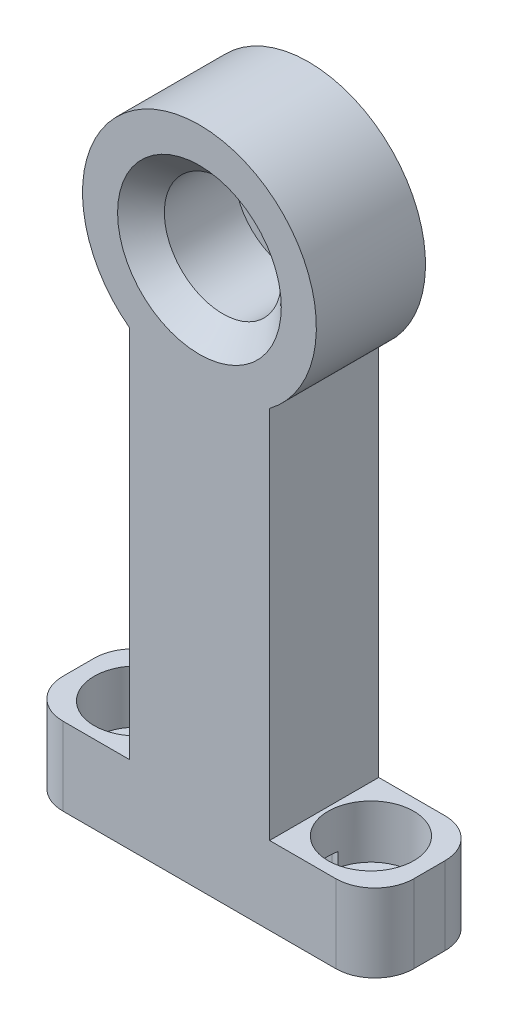
ISO-10303-21;
HEADER;
FILE_DESCRIPTION(('STEP AP214'),'2;1');
FILE_NAME('part.step','',(''),(''),'','','');
FILE_SCHEMA(('AUTOMOTIVE_DESIGN { 1 0 10303 214 1 1 1 1 }'));
ENDSEC;
DATA;
#1=APPLICATION_CONTEXT('core data for automotive mechanical design processes');
#2=APPLICATION_PROTOCOL_DEFINITION('international standard','automotive_design',2000,#1);
#3=PRODUCT_CONTEXT('',#1,'mechanical');
#4=PRODUCT('Part','Part','',(#3));
#5=PRODUCT_RELATED_PRODUCT_CATEGORY('part','',(#4));
#6=PRODUCT_DEFINITION_FORMATION('','',#4);
#7=PRODUCT_DEFINITION_CONTEXT('part definition',#1,'design');
#8=PRODUCT_DEFINITION('design','',#6,#7);
#9=PRODUCT_DEFINITION_SHAPE('','',#8);
#10=(LENGTH_UNIT() NAMED_UNIT(*) SI_UNIT(.MILLI.,.METRE.));
#11=(NAMED_UNIT(*) PLANE_ANGLE_UNIT() SI_UNIT($,.RADIAN.));
#12=(NAMED_UNIT(*) SI_UNIT($,.STERADIAN.) SOLID_ANGLE_UNIT());
#13=UNCERTAINTY_MEASURE_WITH_UNIT(LENGTH_MEASURE(1.E-05),#10,'distance_accuracy_value','');
#14=(GEOMETRIC_REPRESENTATION_CONTEXT(3) GLOBAL_UNCERTAINTY_ASSIGNED_CONTEXT((#13)) GLOBAL_UNIT_ASSIGNED_CONTEXT((#10,
#11,#12)) REPRESENTATION_CONTEXT('',''));
#15=CARTESIAN_POINT('',(0.,0.,0.));
#16=DIRECTION('',(0.,0.,1.));
#17=DIRECTION('',(1.,0.,0.));
#18=AXIS2_PLACEMENT_3D('',#15,#16,#17);
#19=CARTESIAN_POINT('',(0.,0.,7.));
#20=DIRECTION('',(0.,0.,-1.));
#21=DIRECTION('',(-1.,0.,0.));
#22=AXIS2_PLACEMENT_3D('',#19,#20,#21);
#23=CYLINDRICAL_SURFACE('',#22,0.5);
#24=CARTESIAN_POINT('',(0.,0.,-7.));
#25=DIRECTION('',(0.,0.,1.));
#26=DIRECTION('',(1.,0.,0.));
#27=AXIS2_PLACEMENT_3D('',#24,#25,#26);
#28=CIRCLE('',#27,0.5);
#29=CARTESIAN_POINT('',(0.5,0.,-7.));
#30=VERTEX_POINT('',#29);
#31=EDGE_CURVE('E227',#30,#30,#28,.T.);
#32=ORIENTED_EDGE('',*,*,#31,.F.);
#33=EDGE_LOOP('',(#32));
#34=FACE_BOUND('',#33,.T.);
#35=CARTESIAN_POINT('',(0.,0.,-5.));
#36=DIRECTION('',(0.,0.,1.));
#37=DIRECTION('',(1.,0.,0.));
#38=AXIS2_PLACEMENT_3D('',#35,#36,#37);
#39=CIRCLE('',#38,0.5);
#40=CARTESIAN_POINT('',(0.5,0.,-5.));
#41=VERTEX_POINT('',#40);
#42=EDGE_CURVE('E235',#41,#41,#39,.T.);
#43=ORIENTED_EDGE('',*,*,#42,.T.);
#44=EDGE_LOOP('',(#43));
#45=FACE_BOUND('',#44,.T.);
#46=ADVANCED_FACE('F38',(#34,#45),#23,.F.);
#47=CARTESIAN_POINT('',(0.,0.,7.));
#48=DIRECTION('',(0.,0.,1.));
#49=DIRECTION('',(1.,0.,0.));
#50=AXIS2_PLACEMENT_3D('',#47,#48,#49);
#51=PLANE('',#50);
#52=CARTESIAN_POINT('',(0.,0.,7.));
#53=DIRECTION('',(0.,0.,1.));
#54=DIRECTION('',(1.,0.,0.));
#55=AXIS2_PLACEMENT_3D('',#52,#53,#54);
#56=CIRCLE('',#55,10.5);
#57=CARTESIAN_POINT('',(10.5,0.,7.));
#58=VERTEX_POINT('',#57);
#59=EDGE_CURVE('E218',#58,#58,#56,.F.);
#60=ORIENTED_EDGE('',*,*,#59,.T.);
#61=EDGE_LOOP('',(#60));
#62=FACE_BOUND('',#61,.T.);
#63=DIRECTION('',(1.,0.,0.));
#64=VECTOR('',#63,1.);
#65=CARTESIAN_POINT('',(0.,-70.,7.));
#66=LINE('',#65,#64);
#67=CARTESIAN_POINT('',(-17.4999999999999,-70.,7.));
#68=VERTEX_POINT('',#67);
#69=CARTESIAN_POINT('',(17.5,-70.,7.));
#70=VERTEX_POINT('',#69);
#71=EDGE_CURVE('E280',#68,#70,#66,.T.);
#72=ORIENTED_EDGE('',*,*,#71,.T.);
#73=DIRECTION('',(0.,-1.,0.));
#74=VECTOR('',#73,1.);
#75=CARTESIAN_POINT('',(17.5,0.,7.));
#76=LINE('',#75,#74);
#77=CARTESIAN_POINT('',(17.5,-60.,7.));
#78=VERTEX_POINT('',#77);
#79=EDGE_CURVE('E191',#70,#78,#76,.F.);
#80=ORIENTED_EDGE('',*,*,#79,.T.);
#81=DIRECTION('',(-1.,0.,0.));
#82=VECTOR('',#81,1.);
#83=CARTESIAN_POINT('',(0.,-60.,7.));
#84=LINE('',#83,#82);
#85=CARTESIAN_POINT('',(9.,-60.,7.));
#86=VERTEX_POINT('',#85);
#87=EDGE_CURVE('E278',#78,#86,#84,.T.);
#88=ORIENTED_EDGE('',*,*,#87,.T.);
#89=DIRECTION('',(0.,1.,0.));
#90=VECTOR('',#89,1.);
#91=CARTESIAN_POINT('',(9.,0.,7.));
#92=LINE('',#91,#90);
#93=CARTESIAN_POINT('',(9.,-12.,7.));
#94=VERTEX_POINT('',#93);
#95=EDGE_CURVE('E260',#86,#94,#92,.T.);
#96=ORIENTED_EDGE('',*,*,#95,.T.);
#97=CARTESIAN_POINT('',(0.,0.,7.));
#98=DIRECTION('',(0.,0.,1.));
#99=DIRECTION('',(1.,0.,0.));
#100=AXIS2_PLACEMENT_3D('',#97,#98,#99);
#101=CIRCLE('',#100,15.);
#102=CARTESIAN_POINT('',(-9.,-12.,7.));
#103=VERTEX_POINT('',#102);
#104=EDGE_CURVE('E224',#94,#103,#101,.T.);
#105=ORIENTED_EDGE('',*,*,#104,.T.);
#106=DIRECTION('',(0.,1.,0.));
#107=VECTOR('',#106,1.);
#108=CARTESIAN_POINT('',(-9.,0.,7.));
#109=LINE('',#108,#107);
#110=CARTESIAN_POINT('',(-9.,-60.,7.));
#111=VERTEX_POINT('',#110);
#112=EDGE_CURVE('E264',#111,#103,#109,.T.);
#113=ORIENTED_EDGE('',*,*,#112,.F.);
#114=DIRECTION('',(-1.,0.,0.));
#115=VECTOR('',#114,1.);
#116=CARTESIAN_POINT('',(0.,-60.,7.));
#117=LINE('',#116,#115);
#118=CARTESIAN_POINT('',(-17.4999999999999,-60.,7.));
#119=VERTEX_POINT('',#118);
#120=EDGE_CURVE('E283',#111,#119,#117,.T.);
#121=ORIENTED_EDGE('',*,*,#120,.T.);
#122=DIRECTION('',(0.,-1.,0.));
#123=VECTOR('',#122,1.);
#124=CARTESIAN_POINT('',(-17.4999999999999,-70.,7.));
#125=LINE('',#124,#123);
#126=EDGE_CURVE('E193',#119,#68,#125,.T.);
#127=ORIENTED_EDGE('',*,*,#126,.T.);
#128=EDGE_LOOP('',(#72,#80,#88,#96,#105,#113,#121,#127));
#129=FACE_BOUND('',#128,.T.);
#130=ADVANCED_FACE('F372',(#62,#129),#51,.T.);
#131=CARTESIAN_POINT('',(0.,0.,-7.));
#132=DIRECTION('',(0.,0.,1.));
#133=DIRECTION('',(1.,0.,0.));
#134=AXIS2_PLACEMENT_3D('',#131,#132,#133);
#135=PLANE('',#134);
#136=DIRECTION('',(-1.,0.,0.));
#137=VECTOR('',#136,1.);
#138=CARTESIAN_POINT('',(0.,-60.,-7.));
#139=LINE('',#138,#137);
#140=CARTESIAN_POINT('',(17.5,-60.,-7.));
#141=VERTEX_POINT('',#140);
#142=CARTESIAN_POINT('',(9.,-60.,-7.));
#143=VERTEX_POINT('',#142);
#144=EDGE_CURVE('E265',#141,#143,#139,.T.);
#145=ORIENTED_EDGE('',*,*,#144,.F.);
#146=DIRECTION('',(0.,-1.,0.));
#147=VECTOR('',#146,1.);
#148=CARTESIAN_POINT('',(17.5,-70.,-7.));
#149=LINE('',#148,#147);
#150=CARTESIAN_POINT('',(17.5,-70.,-7.));
#151=VERTEX_POINT('',#150);
#152=EDGE_CURVE('E213',#141,#151,#149,.T.);
#153=ORIENTED_EDGE('',*,*,#152,.T.);
#154=DIRECTION('',(1.,0.,0.));
#155=VECTOR('',#154,1.);
#156=CARTESIAN_POINT('',(0.,-70.,-7.));
#157=LINE('',#156,#155);
#158=CARTESIAN_POINT('',(-17.4999999999999,-70.,-7.));
#159=VERTEX_POINT('',#158);
#160=EDGE_CURVE('E267',#159,#151,#157,.T.);
#161=ORIENTED_EDGE('',*,*,#160,.F.);
#162=DIRECTION('',(0.,-1.,0.));
#163=VECTOR('',#162,1.);
#164=CARTESIAN_POINT('',(-17.4999999999999,0.,-7.));
#165=LINE('',#164,#163);
#166=CARTESIAN_POINT('',(-17.4999999999999,-60.,-7.));
#167=VERTEX_POINT('',#166);
#168=EDGE_CURVE('E216',#159,#167,#165,.F.);
#169=ORIENTED_EDGE('',*,*,#168,.T.);
#170=DIRECTION('',(-1.,0.,0.));
#171=VECTOR('',#170,1.);
#172=CARTESIAN_POINT('',(0.,-60.,-7.));
#173=LINE('',#172,#171);
#174=CARTESIAN_POINT('',(-9.,-60.,-7.));
#175=VERTEX_POINT('',#174);
#176=EDGE_CURVE('E270',#175,#167,#173,.T.);
#177=ORIENTED_EDGE('',*,*,#176,.F.);
#178=DIRECTION('',(0.,1.,0.));
#179=VECTOR('',#178,1.);
#180=CARTESIAN_POINT('',(-9.,0.,-7.));
#181=LINE('',#180,#179);
#182=CARTESIAN_POINT('',(-9.,-12.,-7.));
#183=VERTEX_POINT('',#182);
#184=EDGE_CURVE('E272',#175,#183,#181,.T.);
#185=ORIENTED_EDGE('',*,*,#184,.T.);
#186=CARTESIAN_POINT('',(0.,0.,-7.));
#187=DIRECTION('',(0.,0.,1.));
#188=DIRECTION('',(1.,0.,0.));
#189=AXIS2_PLACEMENT_3D('',#186,#187,#188);
#190=CIRCLE('',#189,15.);
#191=CARTESIAN_POINT('',(9.,-12.,-7.));
#192=VERTEX_POINT('',#191);
#193=EDGE_CURVE('E225',#192,#183,#190,.T.);
#194=ORIENTED_EDGE('',*,*,#193,.F.);
#195=DIRECTION('',(0.,1.,0.));
#196=VECTOR('',#195,1.);
#197=CARTESIAN_POINT('',(9.,0.,-7.));
#198=LINE('',#197,#196);
#199=EDGE_CURVE('E261',#143,#192,#198,.T.);
#200=ORIENTED_EDGE('',*,*,#199,.F.);
#201=EDGE_LOOP('',(#145,#153,#161,#169,#177,#185,#194,#200));
#202=FACE_BOUND('',#201,.T.);
#203=ORIENTED_EDGE('',*,*,#31,.T.);
#204=EDGE_LOOP('',(#203));
#205=FACE_BOUND('',#204,.T.);
#206=ADVANCED_FACE('F377',(#202,#205),#135,.F.);
#207=CARTESIAN_POINT('',(0.,0.,7.));
#208=DIRECTION('',(0.,0.,-1.));
#209=DIRECTION('',(-1.,0.,0.));
#210=AXIS2_PLACEMENT_3D('',#207,#208,#209);
#211=CYLINDRICAL_SURFACE('',#210,15.);
#212=ORIENTED_EDGE('',*,*,#193,.T.);
#213=DIRECTION('',(0.,0.,-1.));
#214=VECTOR('',#213,1.);
#215=CARTESIAN_POINT('',(-9.,-12.,7.));
#216=LINE('',#215,#214);
#217=EDGE_CURVE('E238',#103,#183,#216,.T.);
#218=ORIENTED_EDGE('',*,*,#217,.F.);
#219=ORIENTED_EDGE('',*,*,#104,.F.);
#220=DIRECTION('',(0.,0.,-1.));
#221=VECTOR('',#220,1.);
#222=CARTESIAN_POINT('',(9.,-12.,7.));
#223=LINE('',#222,#221);
#224=EDGE_CURVE('E257',#94,#192,#223,.T.);
#225=ORIENTED_EDGE('',*,*,#224,.T.);
#226=EDGE_LOOP('',(#212,#218,#219,#225));
#227=FACE_BOUND('',#226,.T.);
#228=ADVANCED_FACE('F382',(#227),#211,.T.);
#229=CARTESIAN_POINT('',(0.,0.,-5.));
#230=DIRECTION('',(0.,0.,1.));
#231=DIRECTION('',(1.,0.,0.));
#232=AXIS2_PLACEMENT_3D('',#229,#230,#231);
#233=CYLINDRICAL_SURFACE('',#232,7.5);
#234=CARTESIAN_POINT('',(0.,0.,4.));
#235=DIRECTION('',(0.,0.,1.));
#236=DIRECTION('',(1.,0.,0.));
#237=AXIS2_PLACEMENT_3D('',#234,#235,#236);
#238=CIRCLE('',#237,7.5);
#239=CARTESIAN_POINT('',(7.5,0.,4.));
#240=VERTEX_POINT('',#239);
#241=EDGE_CURVE('E221',#240,#240,#238,.T.);
#242=ORIENTED_EDGE('',*,*,#241,.T.);
#243=EDGE_LOOP('',(#242));
#244=FACE_BOUND('',#243,.T.);
#245=CARTESIAN_POINT('',(0.,0.,-5.));
#246=DIRECTION('',(0.,0.,1.));
#247=DIRECTION('',(1.,0.,0.));
#248=AXIS2_PLACEMENT_3D('',#245,#246,#247);
#249=CIRCLE('',#248,7.5);
#250=CARTESIAN_POINT('',(7.5,0.,-5.));
#251=VERTEX_POINT('',#250);
#252=EDGE_CURVE('E232',#251,#251,#249,.T.);
#253=ORIENTED_EDGE('',*,*,#252,.F.);
#254=EDGE_LOOP('',(#253));
#255=FACE_BOUND('',#254,.T.);
#256=ADVANCED_FACE('F422',(#244,#255),#233,.F.);
#257=CARTESIAN_POINT('',(0.,0.,-5.));
#258=DIRECTION('',(0.,0.,1.));
#259=DIRECTION('',(1.,0.,0.));
#260=AXIS2_PLACEMENT_3D('',#257,#258,#259);
#261=PLANE('',#260);
#262=ORIENTED_EDGE('',*,*,#42,.F.);
#263=EDGE_LOOP('',(#262));
#264=FACE_BOUND('',#263,.T.);
#265=ORIENTED_EDGE('',*,*,#252,.T.);
#266=EDGE_LOOP('',(#265));
#267=FACE_BOUND('',#266,.T.);
#268=ADVANCED_FACE('F434',(#264,#267),#261,.T.);
#269=CARTESIAN_POINT('',(0.,0.,4.));
#270=DIRECTION('',(0.,0.,1.));
#271=DIRECTION('',(1.,0.,0.));
#272=AXIS2_PLACEMENT_3D('',#269,#270,#271);
#273=CONICAL_SURFACE('',#272,7.5,0.78539816339745);
#274=ORIENTED_EDGE('',*,*,#59,.F.);
#275=EDGE_LOOP('',(#274));
#276=FACE_BOUND('',#275,.T.);
#277=ORIENTED_EDGE('',*,*,#241,.F.);
#278=EDGE_LOOP('',(#277));
#279=FACE_BOUND('',#278,.T.);
#280=ADVANCED_FACE('F430',(#276,#279),#273,.F.);
#281=CARTESIAN_POINT('',(-9.,0.,7.));
#282=DIRECTION('',(-1.,0.,0.));
#283=DIRECTION('',(0.,0.,1.));
#284=AXIS2_PLACEMENT_3D('',#281,#282,#283);
#285=PLANE('',#284);
#286=ORIENTED_EDGE('',*,*,#184,.F.);
#287=DIRECTION('',(0.,0.,-1.));
#288=VECTOR('',#287,1.);
#289=CARTESIAN_POINT('',(-9.,-60.,7.));
#290=LINE('',#289,#288);
#291=EDGE_CURVE('E241',#111,#175,#290,.T.);
#292=ORIENTED_EDGE('',*,*,#291,.F.);
#293=ORIENTED_EDGE('',*,*,#112,.T.);
#294=ORIENTED_EDGE('',*,*,#217,.T.);
#295=EDGE_LOOP('',(#286,#292,#293,#294));
#296=FACE_BOUND('',#295,.T.);
#297=ADVANCED_FACE('F351',(#296),#285,.T.);
#298=CARTESIAN_POINT('',(0.,-60.,7.));
#299=DIRECTION('',(0.,-1.,0.));
#300=DIRECTION('',(0.,0.,-1.));
#301=AXIS2_PLACEMENT_3D('',#298,#299,#300);
#302=PLANE('',#301);
#303=CARTESIAN_POINT('',(-15.,-60.,0.));
#304=DIRECTION('',(0.,1.,0.));
#305=DIRECTION('',(0.,0.,1.));
#306=AXIS2_PLACEMENT_3D('',#303,#304,#305);
#307=CIRCLE('',#306,5.5);
#308=CARTESIAN_POINT('',(-15.,-60.,5.5));
#309=VERTEX_POINT('',#308);
#310=EDGE_CURVE('E342',#309,#309,#307,.T.);
#311=ORIENTED_EDGE('',*,*,#310,.F.);
#312=EDGE_LOOP('',(#311));
#313=FACE_BOUND('',#312,.T.);
#314=ORIENTED_EDGE('',*,*,#176,.T.);
#315=CARTESIAN_POINT('',(-17.4999999999999,-60.,-2.));
#316=DIRECTION('',(0.,-1.,0.));
#317=DIRECTION('',(0.,0.,-1.));
#318=AXIS2_PLACEMENT_3D('',#315,#316,#317);
#319=CIRCLE('',#318,5.);
#320=CARTESIAN_POINT('',(-22.4999999999999,-60.,-2.));
#321=VERTEX_POINT('',#320);
#322=EDGE_CURVE('E61',#167,#321,#319,.F.);
#323=ORIENTED_EDGE('',*,*,#322,.T.);
#324=DIRECTION('',(0.,0.,-1.));
#325=VECTOR('',#324,1.);
#326=CARTESIAN_POINT('',(-22.4999999999999,-60.,7.));
#327=LINE('',#326,#325);
#328=CARTESIAN_POINT('',(-22.4999999999999,-60.,2.));
#329=VERTEX_POINT('',#328);
#330=EDGE_CURVE('E243',#329,#321,#327,.T.);
#331=ORIENTED_EDGE('',*,*,#330,.F.);
#332=CARTESIAN_POINT('',(-17.4999999999999,-60.,2.));
#333=DIRECTION('',(0.,-1.,0.));
#334=DIRECTION('',(0.,0.,-1.));
#335=AXIS2_PLACEMENT_3D('',#332,#333,#334);
#336=CIRCLE('',#335,5.);
#337=EDGE_CURVE('E184',#329,#119,#336,.F.);
#338=ORIENTED_EDGE('',*,*,#337,.T.);
#339=ORIENTED_EDGE('',*,*,#120,.F.);
#340=ORIENTED_EDGE('',*,*,#291,.T.);
#341=EDGE_LOOP('',(#314,#323,#331,#338,#339,#340));
#342=FACE_BOUND('',#341,.T.);
#343=ADVANCED_FACE('F348',(#313,#342),#302,.F.);
#344=CARTESIAN_POINT('',(-22.4999999999999,0.,7.));
#345=DIRECTION('',(1.,0.,0.));
#346=DIRECTION('',(0.,0.,-1.));
#347=AXIS2_PLACEMENT_3D('',#344,#345,#346);
#348=PLANE('',#347);
#349=ORIENTED_EDGE('',*,*,#330,.T.);
#350=DIRECTION('',(0.,-1.,0.));
#351=VECTOR('',#350,1.);
#352=CARTESIAN_POINT('',(-22.4999999999999,0.,-2.));
#353=LINE('',#352,#351);
#354=CARTESIAN_POINT('',(-22.4999999999999,-70.,-2.));
#355=VERTEX_POINT('',#354);
#356=EDGE_CURVE('E186',#321,#355,#353,.T.);
#357=ORIENTED_EDGE('',*,*,#356,.T.);
#358=DIRECTION('',(0.,0.,-1.));
#359=VECTOR('',#358,1.);
#360=CARTESIAN_POINT('',(-22.4999999999999,-70.,7.));
#361=LINE('',#360,#359);
#362=CARTESIAN_POINT('',(-22.4999999999999,-70.,2.));
#363=VERTEX_POINT('',#362);
#364=EDGE_CURVE('E245',#363,#355,#361,.T.);
#365=ORIENTED_EDGE('',*,*,#364,.F.);
#366=DIRECTION('',(0.,-1.,0.));
#367=VECTOR('',#366,1.);
#368=CARTESIAN_POINT('',(-22.4999999999999,-60.,2.));
#369=LINE('',#368,#367);
#370=EDGE_CURVE('E189',#363,#329,#369,.F.);
#371=ORIENTED_EDGE('',*,*,#370,.T.);
#372=EDGE_LOOP('',(#349,#357,#365,#371));
#373=FACE_BOUND('',#372,.T.);
#374=ADVANCED_FACE('F350',(#373),#348,.F.);
#375=CARTESIAN_POINT('',(0.,-70.,7.));
#376=DIRECTION('',(0.,1.,0.));
#377=DIRECTION('',(0.,0.,1.));
#378=AXIS2_PLACEMENT_3D('',#375,#376,#377);
#379=PLANE('',#378);
#380=CARTESIAN_POINT('',(-15.,-70.,0.));
#381=DIRECTION('',(0.,1.,0.));
#382=DIRECTION('',(0.,0.,1.));
#383=AXIS2_PLACEMENT_3D('',#380,#381,#382);
#384=CIRCLE('',#383,3.2);
#385=CARTESIAN_POINT('',(-15.,-70.,3.2));
#386=VERTEX_POINT('',#385);
#387=EDGE_CURVE('E333',#386,#386,#384,.T.);
#388=ORIENTED_EDGE('',*,*,#387,.T.);
#389=EDGE_LOOP('',(#388));
#390=FACE_BOUND('',#389,.T.);
#391=CARTESIAN_POINT('',(15.,-70.,0.));
#392=DIRECTION('',(0.,1.,0.));
#393=DIRECTION('',(0.,0.,1.));
#394=AXIS2_PLACEMENT_3D('',#391,#392,#393);
#395=CIRCLE('',#394,3.2);
#396=CARTESIAN_POINT('',(15.,-70.,3.19999999999999));
#397=VERTEX_POINT('',#396);
#398=EDGE_CURVE('E326',#397,#397,#395,.T.);
#399=ORIENTED_EDGE('',*,*,#398,.T.);
#400=EDGE_LOOP('',(#399));
#401=FACE_BOUND('',#400,.T.);
#402=CARTESIAN_POINT('',(-7.,-70.,0.));
#403=DIRECTION('',(0.,-1.,0.));
#404=DIRECTION('',(0.,0.,-1.));
#405=AXIS2_PLACEMENT_3D('',#402,#403,#404);
#406=CIRCLE('',#405,2.);
#407=CARTESIAN_POINT('',(-7.,-70.,-2.));
#408=VERTEX_POINT('',#407);
#409=EDGE_CURVE('E322',#408,#408,#406,.T.);
#410=ORIENTED_EDGE('',*,*,#409,.F.);
#411=EDGE_LOOP('',(#410));
#412=FACE_BOUND('',#411,.T.);
#413=DIRECTION('',(1.,0.,0.));
#414=VECTOR('',#413,1.);
#415=CARTESIAN_POINT('',(6.,-70.,-2.));
#416=LINE('',#415,#414);
#417=CARTESIAN_POINT('',(6.,-70.,-2.));
#418=VERTEX_POINT('',#417);
#419=CARTESIAN_POINT('',(8.,-70.,-2.));
#420=VERTEX_POINT('',#419);
#421=EDGE_CURVE('E304',#418,#420,#416,.T.);
#422=ORIENTED_EDGE('',*,*,#421,.F.);
#423=CARTESIAN_POINT('',(6.,-70.,0.));
#424=DIRECTION('',(0.,-1.,0.));
#425=DIRECTION('',(0.,0.,-1.));
#426=AXIS2_PLACEMENT_3D('',#423,#424,#425);
#427=CIRCLE('',#426,2.);
#428=CARTESIAN_POINT('',(6.,-70.,2.));
#429=VERTEX_POINT('',#428);
#430=EDGE_CURVE('E307',#429,#418,#427,.T.);
#431=ORIENTED_EDGE('',*,*,#430,.F.);
#432=DIRECTION('',(-1.,0.,0.));
#433=VECTOR('',#432,1.);
#434=CARTESIAN_POINT('',(6.,-70.,2.));
#435=LINE('',#434,#433);
#436=CARTESIAN_POINT('',(8.,-70.,2.));
#437=VERTEX_POINT('',#436);
#438=EDGE_CURVE('E297',#437,#429,#435,.T.);
#439=ORIENTED_EDGE('',*,*,#438,.F.);
#440=CARTESIAN_POINT('',(8.,-70.,0.));
#441=DIRECTION('',(0.,-1.,0.));
#442=DIRECTION('',(0.,0.,-1.));
#443=AXIS2_PLACEMENT_3D('',#440,#441,#442);
#444=CIRCLE('',#443,2.);
#445=EDGE_CURVE('E301',#420,#437,#444,.T.);
#446=ORIENTED_EDGE('',*,*,#445,.F.);
#447=EDGE_LOOP('',(#422,#431,#439,#446));
#448=FACE_BOUND('',#447,.T.);
#449=ORIENTED_EDGE('',*,*,#160,.T.);
#450=CARTESIAN_POINT('',(17.5,-70.,-2.));
#451=DIRECTION('',(0.,1.,0.));
#452=DIRECTION('',(0.,0.,1.));
#453=AXIS2_PLACEMENT_3D('',#450,#451,#452);
#454=CIRCLE('',#453,5.);
#455=CARTESIAN_POINT('',(22.5,-70.,-2.));
#456=VERTEX_POINT('',#455);
#457=EDGE_CURVE('E205',#151,#456,#454,.F.);
#458=ORIENTED_EDGE('',*,*,#457,.T.);
#459=DIRECTION('',(0.,0.,-1.));
#460=VECTOR('',#459,1.);
#461=CARTESIAN_POINT('',(22.5,-70.,7.));
#462=LINE('',#461,#460);
#463=CARTESIAN_POINT('',(22.5,-70.,2.));
#464=VERTEX_POINT('',#463);
#465=EDGE_CURVE('E248',#464,#456,#462,.T.);
#466=ORIENTED_EDGE('',*,*,#465,.F.);
#467=CARTESIAN_POINT('',(17.5,-70.,2.));
#468=DIRECTION('',(0.,1.,0.));
#469=DIRECTION('',(0.,0.,1.));
#470=AXIS2_PLACEMENT_3D('',#467,#468,#469);
#471=CIRCLE('',#470,5.);
#472=EDGE_CURVE('E207',#464,#70,#471,.F.);
#473=ORIENTED_EDGE('',*,*,#472,.T.);
#474=ORIENTED_EDGE('',*,*,#71,.F.);
#475=CARTESIAN_POINT('',(-17.4999999999999,-70.,2.));
#476=DIRECTION('',(0.,1.,0.));
#477=DIRECTION('',(0.,0.,1.));
#478=AXIS2_PLACEMENT_3D('',#475,#476,#477);
#479=CIRCLE('',#478,5.);
#480=EDGE_CURVE('E211',#68,#363,#479,.F.);
#481=ORIENTED_EDGE('',*,*,#480,.T.);
#482=ORIENTED_EDGE('',*,*,#364,.T.);
#483=CARTESIAN_POINT('',(-17.4999999999999,-70.,-2.));
#484=DIRECTION('',(0.,1.,0.));
#485=DIRECTION('',(0.,0.,1.));
#486=AXIS2_PLACEMENT_3D('',#483,#484,#485);
#487=CIRCLE('',#486,5.);
#488=EDGE_CURVE('E209',#355,#159,#487,.F.);
#489=ORIENTED_EDGE('',*,*,#488,.T.);
#490=EDGE_LOOP('',(#449,#458,#466,#473,#474,#481,#482,#489));
#491=FACE_BOUND('',#490,.T.);
#492=ADVANCED_FACE('F365',(#390,#401,#412,#448,#491),#379,.F.);
#493=CARTESIAN_POINT('',(22.5,0.,7.));
#494=DIRECTION('',(1.,0.,0.));
#495=DIRECTION('',(0.,1.,0.));
#496=AXIS2_PLACEMENT_3D('',#493,#494,#495);
#497=PLANE('',#496);
#498=ORIENTED_EDGE('',*,*,#465,.T.);
#499=DIRECTION('',(0.,-1.,0.));
#500=VECTOR('',#499,1.);
#501=CARTESIAN_POINT('',(22.5,-60.,-2.));
#502=LINE('',#501,#500);
#503=CARTESIAN_POINT('',(22.5,-60.,-2.));
#504=VERTEX_POINT('',#503);
#505=EDGE_CURVE('E200',#456,#504,#502,.F.);
#506=ORIENTED_EDGE('',*,*,#505,.T.);
#507=DIRECTION('',(0.,0.,-1.));
#508=VECTOR('',#507,1.);
#509=CARTESIAN_POINT('',(22.5,-60.,7.));
#510=LINE('',#509,#508);
#511=CARTESIAN_POINT('',(22.5,-60.,2.));
#512=VERTEX_POINT('',#511);
#513=EDGE_CURVE('E251',#512,#504,#510,.T.);
#514=ORIENTED_EDGE('',*,*,#513,.F.);
#515=DIRECTION('',(0.,-1.,0.));
#516=VECTOR('',#515,1.);
#517=CARTESIAN_POINT('',(22.5,0.,2.));
#518=LINE('',#517,#516);
#519=EDGE_CURVE('E202',#512,#464,#518,.T.);
#520=ORIENTED_EDGE('',*,*,#519,.T.);
#521=EDGE_LOOP('',(#498,#506,#514,#520));
#522=FACE_BOUND('',#521,.T.);
#523=ADVANCED_FACE('F398',(#522),#497,.T.);
#524=CARTESIAN_POINT('',(0.,-60.,7.));
#525=DIRECTION('',(0.,-1.,0.));
#526=DIRECTION('',(0.,0.,-1.));
#527=AXIS2_PLACEMENT_3D('',#524,#525,#526);
#528=PLANE('',#527);
#529=CARTESIAN_POINT('',(15.,-60.,0.));
#530=DIRECTION('',(0.,1.,0.));
#531=DIRECTION('',(0.,0.,1.));
#532=AXIS2_PLACEMENT_3D('',#529,#530,#531);
#533=CIRCLE('',#532,5.5);
#534=CARTESIAN_POINT('',(15.,-60.,5.5));
#535=VERTEX_POINT('',#534);
#536=EDGE_CURVE('E178',#535,#535,#533,.T.);
#537=ORIENTED_EDGE('',*,*,#536,.F.);
#538=EDGE_LOOP('',(#537));
#539=FACE_BOUND('',#538,.T.);
#540=ORIENTED_EDGE('',*,*,#513,.T.);
#541=CARTESIAN_POINT('',(17.5,-60.,-2.));
#542=DIRECTION('',(0.,-1.,0.));
#543=DIRECTION('',(0.,0.,-1.));
#544=AXIS2_PLACEMENT_3D('',#541,#542,#543);
#545=CIRCLE('',#544,5.);
#546=EDGE_CURVE('E196',#504,#141,#545,.F.);
#547=ORIENTED_EDGE('',*,*,#546,.T.);
#548=ORIENTED_EDGE('',*,*,#144,.T.);
#549=DIRECTION('',(0.,0.,-1.));
#550=VECTOR('',#549,1.);
#551=CARTESIAN_POINT('',(9.,-60.,7.));
#552=LINE('',#551,#550);
#553=EDGE_CURVE('E254',#86,#143,#552,.T.);
#554=ORIENTED_EDGE('',*,*,#553,.F.);
#555=ORIENTED_EDGE('',*,*,#87,.F.);
#556=CARTESIAN_POINT('',(17.5,-60.,2.));
#557=DIRECTION('',(0.,-1.,0.));
#558=DIRECTION('',(0.,0.,-1.));
#559=AXIS2_PLACEMENT_3D('',#556,#557,#558);
#560=CIRCLE('',#559,5.);
#561=EDGE_CURVE('E198',#78,#512,#560,.F.);
#562=ORIENTED_EDGE('',*,*,#561,.T.);
#563=EDGE_LOOP('',(#540,#547,#548,#554,#555,#562));
#564=FACE_BOUND('',#563,.T.);
#565=ADVANCED_FACE('F389',(#539,#564),#528,.F.);
#566=CARTESIAN_POINT('',(9.,0.,7.));
#567=DIRECTION('',(-1.,0.,0.));
#568=DIRECTION('',(0.,0.,1.));
#569=AXIS2_PLACEMENT_3D('',#566,#567,#568);
#570=PLANE('',#569);
#571=ORIENTED_EDGE('',*,*,#199,.T.);
#572=ORIENTED_EDGE('',*,*,#224,.F.);
#573=ORIENTED_EDGE('',*,*,#95,.F.);
#574=ORIENTED_EDGE('',*,*,#553,.T.);
#575=EDGE_LOOP('',(#571,#572,#573,#574));
#576=FACE_BOUND('',#575,.T.);
#577=ADVANCED_FACE('F385',(#576),#570,.F.);
#578=CARTESIAN_POINT('',(6.,-65.,0.));
#579=DIRECTION('',(0.,-1.,0.));
#580=DIRECTION('',(0.,0.,-1.));
#581=AXIS2_PLACEMENT_3D('',#578,#579,#580);
#582=CYLINDRICAL_SURFACE('',#581,2.);
#583=ORIENTED_EDGE('',*,*,#430,.T.);
#584=DIRECTION('',(0.,-1.,0.));
#585=VECTOR('',#584,1.);
#586=CARTESIAN_POINT('',(6.,-65.,-2.));
#587=LINE('',#586,#585);
#588=CARTESIAN_POINT('',(6.,-65.,-2.));
#589=VERTEX_POINT('',#588);
#590=EDGE_CURVE('E288',#589,#418,#587,.T.);
#591=ORIENTED_EDGE('',*,*,#590,.F.);
#592=CARTESIAN_POINT('',(6.,-65.,0.));
#593=DIRECTION('',(0.,-1.,0.));
#594=DIRECTION('',(0.,0.,-1.));
#595=AXIS2_PLACEMENT_3D('',#592,#593,#594);
#596=CIRCLE('',#595,2.);
#597=CARTESIAN_POINT('',(6.,-65.,2.));
#598=VERTEX_POINT('',#597);
#599=EDGE_CURVE('E300',#598,#589,#596,.T.);
#600=ORIENTED_EDGE('',*,*,#599,.F.);
#601=DIRECTION('',(0.,-1.,0.));
#602=VECTOR('',#601,1.);
#603=CARTESIAN_POINT('',(6.,-65.,2.));
#604=LINE('',#603,#602);
#605=EDGE_CURVE('E275',#598,#429,#604,.T.);
#606=ORIENTED_EDGE('',*,*,#605,.T.);
#607=EDGE_LOOP('',(#583,#591,#600,#606));
#608=FACE_BOUND('',#607,.T.);
#609=ADVANCED_FACE('F681',(#608),#582,.F.);
#610=CARTESIAN_POINT('',(6.,-65.,2.));
#611=DIRECTION('',(0.,0.,1.));
#612=DIRECTION('',(1.,0.,0.));
#613=AXIS2_PLACEMENT_3D('',#610,#611,#612);
#614=PLANE('',#613);
#615=ORIENTED_EDGE('',*,*,#438,.T.);
#616=ORIENTED_EDGE('',*,*,#605,.F.);
#617=DIRECTION('',(-1.,0.,0.));
#618=VECTOR('',#617,1.);
#619=CARTESIAN_POINT('',(6.,-65.,2.));
#620=LINE('',#619,#618);
#621=CARTESIAN_POINT('',(8.,-65.,2.));
#622=VERTEX_POINT('',#621);
#623=EDGE_CURVE('E292',#622,#598,#620,.T.);
#624=ORIENTED_EDGE('',*,*,#623,.F.);
#625=DIRECTION('',(0.,-1.,0.));
#626=VECTOR('',#625,1.);
#627=CARTESIAN_POINT('',(8.,-65.,2.));
#628=LINE('',#627,#626);
#629=EDGE_CURVE('E294',#622,#437,#628,.T.);
#630=ORIENTED_EDGE('',*,*,#629,.T.);
#631=EDGE_LOOP('',(#615,#616,#624,#630));
#632=FACE_BOUND('',#631,.T.);
#633=ADVANCED_FACE('F611',(#632),#614,.F.);
#634=CARTESIAN_POINT('',(8.,-65.,0.));
#635=DIRECTION('',(0.,-1.,0.));
#636=DIRECTION('',(0.,0.,-1.));
#637=AXIS2_PLACEMENT_3D('',#634,#635,#636);
#638=CYLINDRICAL_SURFACE('',#637,2.);
#639=CARTESIAN_POINT('',(8.,-65.,0.));
#640=DIRECTION('',(0.,-1.,0.));
#641=DIRECTION('',(0.,0.,-1.));
#642=AXIS2_PLACEMENT_3D('',#639,#640,#641);
#643=CIRCLE('',#642,2.);
#644=CARTESIAN_POINT('',(9.62500000000001,-65.,1.16592238163609));
#645=VERTEX_POINT('',#644);
#646=EDGE_CURVE('E314',#645,#622,#643,.T.);
#647=ORIENTED_EDGE('',*,*,#646,.F.);
#648=DIRECTION('',(0.,1.,0.));
#649=VECTOR('',#648,1.);
#650=CARTESIAN_POINT('',(9.62500000000001,-63.4,1.16592238163609));
#651=LINE('',#650,#649);
#652=CARTESIAN_POINT('',(9.62500000000001,-66.8,1.16592238163609));
#653=VERTEX_POINT('',#652);
#654=EDGE_CURVE('E11',#645,#653,#651,.F.);
#655=ORIENTED_EDGE('',*,*,#654,.T.);
#656=CARTESIAN_POINT('',(8.,-66.8,0.));
#657=DIRECTION('',(0.,-1.,0.));
#658=DIRECTION('',(0.,0.,-1.));
#659=AXIS2_PLACEMENT_3D('',#656,#657,#658);
#660=CIRCLE('',#659,2.);
#661=CARTESIAN_POINT('',(9.62500000000001,-66.8,-1.16592238163609));
#662=VERTEX_POINT('',#661);
#663=EDGE_CURVE('E46',#653,#662,#660,.F.);
#664=ORIENTED_EDGE('',*,*,#663,.T.);
#665=DIRECTION('',(0.,1.,0.));
#666=VECTOR('',#665,1.);
#667=CARTESIAN_POINT('',(9.62500000000001,-63.4,-1.16592238163609));
#668=LINE('',#667,#666);
#669=CARTESIAN_POINT('',(9.62500000000001,-65.,-1.16592238163609));
#670=VERTEX_POINT('',#669);
#671=EDGE_CURVE('E166',#662,#670,#668,.T.);
#672=ORIENTED_EDGE('',*,*,#671,.T.);
#673=CARTESIAN_POINT('',(8.,-65.,-2.));
#674=VERTEX_POINT('',#673);
#675=EDGE_CURVE('E312',#674,#670,#643,.T.);
#676=ORIENTED_EDGE('',*,*,#675,.F.);
#677=DIRECTION('',(0.,-1.,0.));
#678=VECTOR('',#677,1.);
#679=CARTESIAN_POINT('',(8.,-65.,-2.));
#680=LINE('',#679,#678);
#681=EDGE_CURVE('E291',#674,#420,#680,.T.);
#682=ORIENTED_EDGE('',*,*,#681,.T.);
#683=ORIENTED_EDGE('',*,*,#445,.T.);
#684=ORIENTED_EDGE('',*,*,#629,.F.);
#685=EDGE_LOOP('',(#647,#655,#664,#672,#676,#682,#683,#684));
#686=FACE_BOUND('',#685,.T.);
#687=ADVANCED_FACE('F181',(#686),#638,.F.);
#688=CARTESIAN_POINT('',(6.,-65.,-2.));
#689=DIRECTION('',(0.,0.,-1.));
#690=DIRECTION('',(-1.,0.,0.));
#691=AXIS2_PLACEMENT_3D('',#688,#689,#690);
#692=PLANE('',#691);
#693=ORIENTED_EDGE('',*,*,#421,.T.);
#694=ORIENTED_EDGE('',*,*,#681,.F.);
#695=DIRECTION('',(1.,0.,0.));
#696=VECTOR('',#695,1.);
#697=CARTESIAN_POINT('',(6.,-65.,-2.));
#698=LINE('',#697,#696);
#699=EDGE_CURVE('E315',#589,#674,#698,.T.);
#700=ORIENTED_EDGE('',*,*,#699,.F.);
#701=ORIENTED_EDGE('',*,*,#590,.T.);
#702=EDGE_LOOP('',(#693,#694,#700,#701));
#703=FACE_BOUND('',#702,.T.);
#704=ADVANCED_FACE('F504',(#703),#692,.F.);
#705=CARTESIAN_POINT('',(6.,-65.,0.));
#706=DIRECTION('',(0.,-1.,0.));
#707=DIRECTION('',(0.,0.,-1.));
#708=AXIS2_PLACEMENT_3D('',#705,#706,#707);
#709=PLANE('',#708);
#710=CARTESIAN_POINT('',(15.,-65.,0.));
#711=DIRECTION('',(0.,-1.,0.));
#712=DIRECTION('',(0.,0.,-1.));
#713=AXIS2_PLACEMENT_3D('',#710,#711,#712);
#714=CIRCLE('',#713,5.5);
#715=EDGE_CURVE('E53',#645,#670,#714,.T.);
#716=ORIENTED_EDGE('',*,*,#715,.F.);
#717=ORIENTED_EDGE('',*,*,#646,.T.);
#718=ORIENTED_EDGE('',*,*,#623,.T.);
#719=ORIENTED_EDGE('',*,*,#599,.T.);
#720=ORIENTED_EDGE('',*,*,#699,.T.);
#721=ORIENTED_EDGE('',*,*,#675,.T.);
#722=EDGE_LOOP('',(#716,#717,#718,#719,#720,#721));
#723=FACE_BOUND('',#722,.T.);
#724=ADVANCED_FACE('F409',(#723),#709,.T.);
#725=CARTESIAN_POINT('',(17.5,0.,-2.));
#726=DIRECTION('',(0.,1.,0.));
#727=DIRECTION('',(-1.,0.,0.));
#728=AXIS2_PLACEMENT_3D('',#725,#726,#727);
#729=CYLINDRICAL_SURFACE('',#728,5.);
#730=ORIENTED_EDGE('',*,*,#546,.F.);
#731=ORIENTED_EDGE('',*,*,#505,.F.);
#732=ORIENTED_EDGE('',*,*,#457,.F.);
#733=ORIENTED_EDGE('',*,*,#152,.F.);
#734=EDGE_LOOP('',(#730,#731,#732,#733));
#735=FACE_BOUND('',#734,.T.);
#736=ADVANCED_FACE('F394',(#735),#729,.T.);
#737=CARTESIAN_POINT('',(17.5,0.,2.));
#738=DIRECTION('',(0.,-1.,0.));
#739=DIRECTION('',(1.,0.,0.));
#740=AXIS2_PLACEMENT_3D('',#737,#738,#739);
#741=CYLINDRICAL_SURFACE('',#740,5.);
#742=ORIENTED_EDGE('',*,*,#561,.F.);
#743=ORIENTED_EDGE('',*,*,#79,.F.);
#744=ORIENTED_EDGE('',*,*,#472,.F.);
#745=ORIENTED_EDGE('',*,*,#519,.F.);
#746=EDGE_LOOP('',(#742,#743,#744,#745));
#747=FACE_BOUND('',#746,.T.);
#748=ADVANCED_FACE('F402',(#747),#741,.T.);
#749=CARTESIAN_POINT('',(-17.4999999999999,0.,-2.));
#750=DIRECTION('',(0.,-1.,0.));
#751=DIRECTION('',(0.,0.,-1.));
#752=AXIS2_PLACEMENT_3D('',#749,#750,#751);
#753=CYLINDRICAL_SURFACE('',#752,5.);
#754=ORIENTED_EDGE('',*,*,#322,.F.);
#755=ORIENTED_EDGE('',*,*,#168,.F.);
#756=ORIENTED_EDGE('',*,*,#488,.F.);
#757=ORIENTED_EDGE('',*,*,#356,.F.);
#758=EDGE_LOOP('',(#754,#755,#756,#757));
#759=FACE_BOUND('',#758,.T.);
#760=ADVANCED_FACE('F360',(#759),#753,.T.);
#761=CARTESIAN_POINT('',(-17.4999999999999,0.,2.));
#762=DIRECTION('',(0.,1.,0.));
#763=DIRECTION('',(0.,0.,1.));
#764=AXIS2_PLACEMENT_3D('',#761,#762,#763);
#765=CYLINDRICAL_SURFACE('',#764,5.);
#766=ORIENTED_EDGE('',*,*,#337,.F.);
#767=ORIENTED_EDGE('',*,*,#370,.F.);
#768=ORIENTED_EDGE('',*,*,#480,.F.);
#769=ORIENTED_EDGE('',*,*,#126,.F.);
#770=EDGE_LOOP('',(#766,#767,#768,#769));
#771=FACE_BOUND('',#770,.T.);
#772=ADVANCED_FACE('F40',(#771),#765,.T.);
#773=CARTESIAN_POINT('',(-7.,-65.,0.));
#774=DIRECTION('',(0.,-1.,0.));
#775=DIRECTION('',(0.,0.,-1.));
#776=AXIS2_PLACEMENT_3D('',#773,#774,#775);
#777=CONICAL_SURFACE('',#776,2.,1.02974425867665);
#778=CARTESIAN_POINT('',(-7.,-63.7982787619449,0.));
#779=VERTEX_POINT('',#778);
#780=VERTEX_LOOP('',#779);
#781=FACE_BOUND('',#780,.T.);
#782=CARTESIAN_POINT('',(-7.,-65.,0.));
#783=DIRECTION('',(0.,-1.,0.));
#784=DIRECTION('',(0.,0.,-1.));
#785=AXIS2_PLACEMENT_3D('',#782,#783,#784);
#786=CIRCLE('',#785,2.);
#787=CARTESIAN_POINT('',(-7.,-65.,-2.));
#788=VERTEX_POINT('',#787);
#789=EDGE_CURVE('E309',#788,#788,#786,.T.);
#790=ORIENTED_EDGE('',*,*,#789,.T.);
#791=EDGE_LOOP('',(#790));
#792=FACE_BOUND('',#791,.T.);
#793=ADVANCED_FACE('F561',(#781,#792),#777,.F.);
#794=CARTESIAN_POINT('',(-7.,-70.,0.));
#795=DIRECTION('',(0.,-1.,0.));
#796=DIRECTION('',(0.,0.,-1.));
#797=AXIS2_PLACEMENT_3D('',#794,#795,#796);
#798=CYLINDRICAL_SURFACE('',#797,2.);
#799=ORIENTED_EDGE('',*,*,#789,.F.);
#800=EDGE_LOOP('',(#799));
#801=FACE_BOUND('',#800,.T.);
#802=ORIENTED_EDGE('',*,*,#409,.T.);
#803=EDGE_LOOP('',(#802));
#804=FACE_BOUND('',#803,.T.);
#805=ADVANCED_FACE('F569',(#801,#804),#798,.F.);
#806=CARTESIAN_POINT('',(18.2,-66.8,0.));
#807=DIRECTION('',(0.,-1.,0.));
#808=DIRECTION('',(0.,0.,-1.));
#809=AXIS2_PLACEMENT_3D('',#806,#807,#808);
#810=PLANE('',#809);
#811=CARTESIAN_POINT('',(15.,-66.8,0.));
#812=DIRECTION('',(0.,1.,0.));
#813=DIRECTION('',(0.,0.,1.));
#814=AXIS2_PLACEMENT_3D('',#811,#812,#813);
#815=CIRCLE('',#814,3.2);
#816=CARTESIAN_POINT('',(15.,-66.8,3.19999999999999));
#817=VERTEX_POINT('',#816);
#818=EDGE_CURVE('E177',#817,#817,#815,.T.);
#819=ORIENTED_EDGE('',*,*,#818,.F.);
#820=EDGE_LOOP('',(#819));
#821=FACE_BOUND('',#820,.T.);
#822=CARTESIAN_POINT('',(15.,-66.8,0.));
#823=DIRECTION('',(0.,1.,0.));
#824=DIRECTION('',(0.,0.,1.));
#825=AXIS2_PLACEMENT_3D('',#822,#823,#824);
#826=CIRCLE('',#825,5.5);
#827=EDGE_CURVE('E169',#653,#662,#826,.T.);
#828=ORIENTED_EDGE('',*,*,#827,.T.);
#829=ORIENTED_EDGE('',*,*,#663,.F.);
#830=EDGE_LOOP('',(#828,#829));
#831=FACE_BOUND('',#830,.T.);
#832=ADVANCED_FACE('F176',(#821,#831),#810,.F.);
#833=CARTESIAN_POINT('',(15.,-60.,0.));
#834=DIRECTION('',(0.,1.,0.));
#835=DIRECTION('',(0.,0.,1.));
#836=AXIS2_PLACEMENT_3D('',#833,#834,#835);
#837=CYLINDRICAL_SURFACE('',#836,5.5);
#838=ORIENTED_EDGE('',*,*,#536,.T.);
#839=EDGE_LOOP('',(#838));
#840=FACE_BOUND('',#839,.T.);
#841=ORIENTED_EDGE('',*,*,#715,.T.);
#842=ORIENTED_EDGE('',*,*,#671,.F.);
#843=ORIENTED_EDGE('',*,*,#827,.F.);
#844=ORIENTED_EDGE('',*,*,#654,.F.);
#845=EDGE_LOOP('',(#841,#842,#843,#844));
#846=FACE_BOUND('',#845,.T.);
#847=ADVANCED_FACE('F168',(#840,#846),#837,.F.);
#848=CARTESIAN_POINT('',(15.,-60.,0.));
#849=DIRECTION('',(0.,1.,0.));
#850=DIRECTION('',(0.,0.,1.));
#851=AXIS2_PLACEMENT_3D('',#848,#849,#850);
#852=CYLINDRICAL_SURFACE('',#851,3.2);
#853=ORIENTED_EDGE('',*,*,#398,.F.);
#854=EDGE_LOOP('',(#853));
#855=FACE_BOUND('',#854,.T.);
#856=ORIENTED_EDGE('',*,*,#818,.T.);
#857=EDGE_LOOP('',(#856));
#858=FACE_BOUND('',#857,.T.);
#859=ADVANCED_FACE('F636',(#855,#858),#852,.F.);
#860=CARTESIAN_POINT('',(-15.,-60.,0.));
#861=DIRECTION('',(0.,1.,0.));
#862=DIRECTION('',(0.,0.,1.));
#863=AXIS2_PLACEMENT_3D('',#860,#861,#862);
#864=CYLINDRICAL_SURFACE('',#863,3.2);
#865=ORIENTED_EDGE('',*,*,#387,.F.);
#866=EDGE_LOOP('',(#865));
#867=FACE_BOUND('',#866,.T.);
#868=CARTESIAN_POINT('',(-15.,-66.8,0.));
#869=DIRECTION('',(0.,1.,0.));
#870=DIRECTION('',(0.,0.,1.));
#871=AXIS2_PLACEMENT_3D('',#868,#869,#870);
#872=CIRCLE('',#871,3.2);
#873=CARTESIAN_POINT('',(-15.,-66.8,3.2));
#874=VERTEX_POINT('',#873);
#875=EDGE_CURVE('E336',#874,#874,#872,.T.);
#876=ORIENTED_EDGE('',*,*,#875,.T.);
#877=EDGE_LOOP('',(#876));
#878=FACE_BOUND('',#877,.T.);
#879=ADVANCED_FACE('F646',(#867,#878),#864,.F.);
#880=CARTESIAN_POINT('',(-11.8,-66.8,0.));
#881=DIRECTION('',(0.,-1.,0.));
#882=DIRECTION('',(0.,0.,-1.));
#883=AXIS2_PLACEMENT_3D('',#880,#881,#882);
#884=PLANE('',#883);
#885=ORIENTED_EDGE('',*,*,#875,.F.);
#886=EDGE_LOOP('',(#885));
#887=FACE_BOUND('',#886,.T.);
#888=CARTESIAN_POINT('',(-15.,-66.8,0.));
#889=DIRECTION('',(0.,1.,0.));
#890=DIRECTION('',(0.,0.,1.));
#891=AXIS2_PLACEMENT_3D('',#888,#889,#890);
#892=CIRCLE('',#891,5.5);
#893=CARTESIAN_POINT('',(-15.,-66.8,5.5));
#894=VERTEX_POINT('',#893);
#895=EDGE_CURVE('E339',#894,#894,#892,.T.);
#896=ORIENTED_EDGE('',*,*,#895,.T.);
#897=EDGE_LOOP('',(#896));
#898=FACE_BOUND('',#897,.T.);
#899=ADVANCED_FACE('F656',(#887,#898),#884,.F.);
#900=CARTESIAN_POINT('',(-15.,-60.,0.));
#901=DIRECTION('',(0.,1.,0.));
#902=DIRECTION('',(0.,0.,1.));
#903=AXIS2_PLACEMENT_3D('',#900,#901,#902);
#904=CYLINDRICAL_SURFACE('',#903,5.5);
#905=ORIENTED_EDGE('',*,*,#895,.F.);
#906=EDGE_LOOP('',(#905));
#907=FACE_BOUND('',#906,.T.);
#908=ORIENTED_EDGE('',*,*,#310,.T.);
#909=EDGE_LOOP('',(#908));
#910=FACE_BOUND('',#909,.T.);
#911=ADVANCED_FACE('F346',(#907,#910),#904,.F.);
#912=CLOSED_SHELL('',(#46,#130,#206,#228,#256,#268,#280,#297,#343,#374,#492,#523,#565,#577,#609,
#633,#687,#704,#724,#736,#748,#760,#772,#793,#805,#832,#847,#859,#879,#899,#911));
#913=MANIFOLD_SOLID_BREP('B2',#912);
#914=ADVANCED_BREP_SHAPE_REPRESENTATION('',(#18,#913),#14);
#915=SHAPE_DEFINITION_REPRESENTATION(#9,#914);
ENDSEC;
END-ISO-10303-21;
